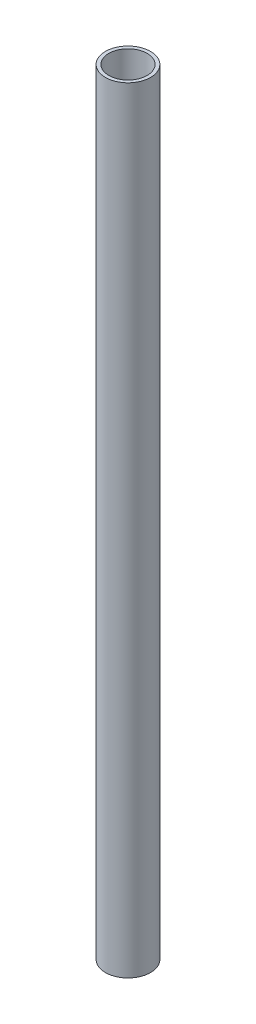
ISO-10303-21;
HEADER;
FILE_DESCRIPTION(('STEP AP214'),'2;1');
FILE_NAME('part.step','',(''),(''),'','','');
FILE_SCHEMA(('AUTOMOTIVE_DESIGN { 1 0 10303 214 1 1 1 1 }'));
ENDSEC;
DATA;
#1=APPLICATION_CONTEXT('core data for automotive mechanical design processes');
#2=APPLICATION_PROTOCOL_DEFINITION('international standard','automotive_design',2000,#1);
#3=PRODUCT_CONTEXT('',#1,'mechanical');
#4=PRODUCT('Part','Part','',(#3));
#5=PRODUCT_RELATED_PRODUCT_CATEGORY('part','',(#4));
#6=PRODUCT_DEFINITION_FORMATION('','',#4);
#7=PRODUCT_DEFINITION_CONTEXT('part definition',#1,'design');
#8=PRODUCT_DEFINITION('design','',#6,#7);
#9=PRODUCT_DEFINITION_SHAPE('','',#8);
#10=(LENGTH_UNIT() NAMED_UNIT(*) SI_UNIT(.MILLI.,.METRE.));
#11=(NAMED_UNIT(*) PLANE_ANGLE_UNIT() SI_UNIT($,.RADIAN.));
#12=(NAMED_UNIT(*) SI_UNIT($,.STERADIAN.) SOLID_ANGLE_UNIT());
#13=UNCERTAINTY_MEASURE_WITH_UNIT(LENGTH_MEASURE(1.E-05),#10,'distance_accuracy_value','');
#14=(GEOMETRIC_REPRESENTATION_CONTEXT(3) GLOBAL_UNCERTAINTY_ASSIGNED_CONTEXT((#13)) GLOBAL_UNIT_ASSIGNED_CONTEXT((#10,
#11,#12)) REPRESENTATION_CONTEXT('',''));
#15=CARTESIAN_POINT('',(0.,0.,0.));
#16=DIRECTION('',(0.,0.,1.));
#17=DIRECTION('',(1.,0.,0.));
#18=AXIS2_PLACEMENT_3D('',#15,#16,#17);
#19=CARTESIAN_POINT('',(0.,550.,0.));
#20=DIRECTION('',(0.,1.,0.));
#21=DIRECTION('',(0.,0.,1.));
#22=AXIS2_PLACEMENT_3D('',#19,#20,#21);
#23=PLANE('',#22);
#24=CARTESIAN_POINT('',(0.,550.,0.));
#25=DIRECTION('',(0.,1.,0.));
#26=DIRECTION('',(0.,0.,1.));
#27=AXIS2_PLACEMENT_3D('',#24,#25,#26);
#28=CIRCLE('',#27,16.);
#29=CARTESIAN_POINT('',(0.,550.,16.));
#30=VERTEX_POINT('',#29);
#31=EDGE_CURVE('E10',#30,#30,#28,.T.);
#32=ORIENTED_EDGE('',*,*,#31,.T.);
#33=EDGE_LOOP('',(#32));
#34=FACE_BOUND('',#33,.T.);
#35=CARTESIAN_POINT('',(0.,550.,0.));
#36=DIRECTION('',(0.,1.,0.));
#37=DIRECTION('',(0.,0.,1.));
#38=AXIS2_PLACEMENT_3D('',#35,#36,#37);
#39=CIRCLE('',#38,13.6);
#40=CARTESIAN_POINT('',(0.,550.,13.6));
#41=VERTEX_POINT('',#40);
#42=EDGE_CURVE('E48',#41,#41,#39,.T.);
#43=ORIENTED_EDGE('',*,*,#42,.F.);
#44=EDGE_LOOP('',(#43));
#45=FACE_BOUND('',#44,.T.);
#46=ADVANCED_FACE('F37',(#34,#45),#23,.T.);
#47=CARTESIAN_POINT('',(0.,0.,0.));
#48=DIRECTION('',(0.,1.,0.));
#49=DIRECTION('',(0.,0.,1.));
#50=AXIS2_PLACEMENT_3D('',#47,#48,#49);
#51=PLANE('',#50);
#52=CARTESIAN_POINT('',(0.,0.,0.));
#53=DIRECTION('',(0.,1.,0.));
#54=DIRECTION('',(0.,0.,1.));
#55=AXIS2_PLACEMENT_3D('',#52,#53,#54);
#56=CIRCLE('',#55,16.);
#57=CARTESIAN_POINT('',(0.,0.,16.));
#58=VERTEX_POINT('',#57);
#59=EDGE_CURVE('E41',#58,#58,#56,.T.);
#60=ORIENTED_EDGE('',*,*,#59,.F.);
#61=EDGE_LOOP('',(#60));
#62=FACE_BOUND('',#61,.T.);
#63=CARTESIAN_POINT('',(0.,0.,0.));
#64=DIRECTION('',(0.,1.,0.));
#65=DIRECTION('',(0.,0.,1.));
#66=AXIS2_PLACEMENT_3D('',#63,#64,#65);
#67=CIRCLE('',#66,13.6);
#68=CARTESIAN_POINT('',(0.,0.,13.6));
#69=VERTEX_POINT('',#68);
#70=EDGE_CURVE('E50',#69,#69,#67,.T.);
#71=ORIENTED_EDGE('',*,*,#70,.T.);
#72=EDGE_LOOP('',(#71));
#73=FACE_BOUND('',#72,.T.);
#74=ADVANCED_FACE('F60',(#62,#73),#51,.F.);
#75=CARTESIAN_POINT('',(0.,550.,0.));
#76=DIRECTION('',(0.,-1.,0.));
#77=DIRECTION('',(0.,0.,-1.));
#78=AXIS2_PLACEMENT_3D('',#75,#76,#77);
#79=CYLINDRICAL_SURFACE('',#78,16.);
#80=ORIENTED_EDGE('',*,*,#31,.F.);
#81=EDGE_LOOP('',(#80));
#82=FACE_BOUND('',#81,.T.);
#83=ORIENTED_EDGE('',*,*,#59,.T.);
#84=EDGE_LOOP('',(#83));
#85=FACE_BOUND('',#84,.T.);
#86=ADVANCED_FACE('F39',(#82,#85),#79,.T.);
#87=CARTESIAN_POINT('',(0.,550.,0.));
#88=DIRECTION('',(0.,-1.,0.));
#89=DIRECTION('',(0.,0.,-1.));
#90=AXIS2_PLACEMENT_3D('',#87,#88,#89);
#91=CYLINDRICAL_SURFACE('',#90,13.6);
#92=ORIENTED_EDGE('',*,*,#42,.T.);
#93=EDGE_LOOP('',(#92));
#94=FACE_BOUND('',#93,.T.);
#95=ORIENTED_EDGE('',*,*,#70,.F.);
#96=EDGE_LOOP('',(#95));
#97=FACE_BOUND('',#96,.T.);
#98=ADVANCED_FACE('F56',(#94,#97),#91,.F.);
#99=CLOSED_SHELL('',(#46,#74,#86,#98));
#100=MANIFOLD_SOLID_BREP('B2',#99);
#101=ADVANCED_BREP_SHAPE_REPRESENTATION('',(#18,#100),#14);
#102=SHAPE_DEFINITION_REPRESENTATION(#9,#101);
ENDSEC;
END-ISO-10303-21;
